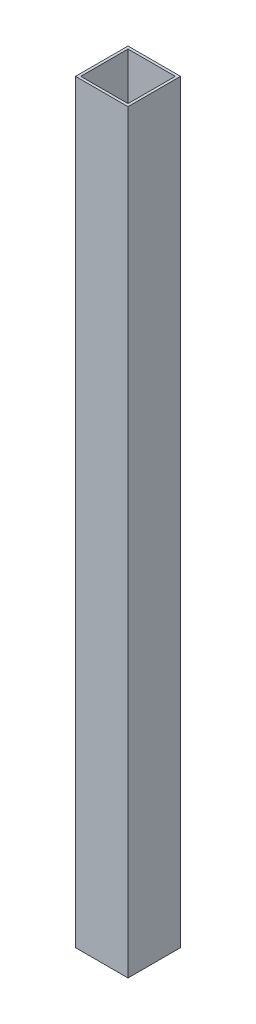
ISO-10303-21;
HEADER;
FILE_DESCRIPTION(('STEP AP214'),'2;1');
FILE_NAME('part.step','',(''),(''),'','','');
FILE_SCHEMA(('AUTOMOTIVE_DESIGN { 1 0 10303 214 1 1 1 1 }'));
ENDSEC;
DATA;
#1=APPLICATION_CONTEXT('core data for automotive mechanical design processes');
#2=APPLICATION_PROTOCOL_DEFINITION('international standard','automotive_design',2000,#1);
#3=PRODUCT_CONTEXT('',#1,'mechanical');
#4=PRODUCT('Part','Part','',(#3));
#5=PRODUCT_RELATED_PRODUCT_CATEGORY('part','',(#4));
#6=PRODUCT_DEFINITION_FORMATION('','',#4);
#7=PRODUCT_DEFINITION_CONTEXT('part definition',#1,'design');
#8=PRODUCT_DEFINITION('design','',#6,#7);
#9=PRODUCT_DEFINITION_SHAPE('','',#8);
#10=(LENGTH_UNIT() NAMED_UNIT(*) SI_UNIT(.MILLI.,.METRE.));
#11=(NAMED_UNIT(*) PLANE_ANGLE_UNIT() SI_UNIT($,.RADIAN.));
#12=(NAMED_UNIT(*) SI_UNIT($,.STERADIAN.) SOLID_ANGLE_UNIT());
#13=UNCERTAINTY_MEASURE_WITH_UNIT(LENGTH_MEASURE(1.E-05),#10,'distance_accuracy_value','');
#14=(GEOMETRIC_REPRESENTATION_CONTEXT(3) GLOBAL_UNCERTAINTY_ASSIGNED_CONTEXT((#13)) GLOBAL_UNIT_ASSIGNED_CONTEXT((#10,
#11,#12)) REPRESENTATION_CONTEXT('',''));
#15=CARTESIAN_POINT('',(0.,0.,0.));
#16=DIRECTION('',(0.,0.,1.));
#17=DIRECTION('',(1.,0.,0.));
#18=AXIS2_PLACEMENT_3D('',#15,#16,#17);
#19=CARTESIAN_POINT('',(0.,287.33,0.));
#20=DIRECTION('',(0.,-1.,0.));
#21=DIRECTION('',(0.,0.,-1.));
#22=AXIS2_PLACEMENT_3D('',#19,#20,#21);
#23=PLANE('',#22);
#24=DIRECTION('',(0.,0.,1.));
#25=VECTOR('',#24,1.);
#26=CARTESIAN_POINT('',(-10.,287.33,-10.));
#27=LINE('',#26,#25);
#28=CARTESIAN_POINT('',(-10.,287.33,-10.));
#29=VERTEX_POINT('',#28);
#30=CARTESIAN_POINT('',(-10.,287.33,10.));
#31=VERTEX_POINT('',#30);
#32=EDGE_CURVE('E155',#29,#31,#27,.T.);
#33=ORIENTED_EDGE('',*,*,#32,.T.);
#34=DIRECTION('',(1.,0.,0.));
#35=VECTOR('',#34,1.);
#36=CARTESIAN_POINT('',(10.,287.33,10.));
#37=LINE('',#36,#35);
#38=CARTESIAN_POINT('',(10.,287.33,10.));
#39=VERTEX_POINT('',#38);
#40=EDGE_CURVE('E159',#31,#39,#37,.T.);
#41=ORIENTED_EDGE('',*,*,#40,.T.);
#42=DIRECTION('',(0.,0.,-1.));
#43=VECTOR('',#42,1.);
#44=CARTESIAN_POINT('',(10.,287.33,-10.));
#45=LINE('',#44,#43);
#46=CARTESIAN_POINT('',(10.,287.33,-10.));
#47=VERTEX_POINT('',#46);
#48=EDGE_CURVE('E163',#39,#47,#45,.T.);
#49=ORIENTED_EDGE('',*,*,#48,.T.);
#50=DIRECTION('',(-1.,0.,0.));
#51=VECTOR('',#50,1.);
#52=CARTESIAN_POINT('',(10.,287.33,-10.));
#53=LINE('',#52,#51);
#54=EDGE_CURVE('E166',#47,#29,#53,.T.);
#55=ORIENTED_EDGE('',*,*,#54,.T.);
#56=EDGE_LOOP('',(#33,#41,#49,#55));
#57=FACE_BOUND('',#56,.T.);
#58=DIRECTION('',(0.,0.,1.));
#59=VECTOR('',#58,1.);
#60=CARTESIAN_POINT('',(-8.99999999999999,287.33,-9.));
#61=LINE('',#60,#59);
#62=CARTESIAN_POINT('',(-8.99999999999999,287.33,-9.));
#63=VERTEX_POINT('',#62);
#64=CARTESIAN_POINT('',(-8.99999999999999,287.33,9.));
#65=VERTEX_POINT('',#64);
#66=EDGE_CURVE('E107',#63,#65,#61,.T.);
#67=ORIENTED_EDGE('',*,*,#66,.F.);
#68=DIRECTION('',(-1.,0.,0.));
#69=VECTOR('',#68,1.);
#70=CARTESIAN_POINT('',(8.99999999999999,287.33,-9.));
#71=LINE('',#70,#69);
#72=CARTESIAN_POINT('',(8.99999999999999,287.33,-9.));
#73=VERTEX_POINT('',#72);
#74=EDGE_CURVE('E133',#73,#63,#71,.T.);
#75=ORIENTED_EDGE('',*,*,#74,.F.);
#76=DIRECTION('',(0.,0.,-1.));
#77=VECTOR('',#76,1.);
#78=CARTESIAN_POINT('',(8.99999999999999,287.33,-9.));
#79=LINE('',#78,#77);
#80=CARTESIAN_POINT('',(8.99999999999999,287.33,9.));
#81=VERTEX_POINT('',#80);
#82=EDGE_CURVE('E129',#81,#73,#79,.T.);
#83=ORIENTED_EDGE('',*,*,#82,.F.);
#84=DIRECTION('',(1.,0.,0.));
#85=VECTOR('',#84,1.);
#86=CARTESIAN_POINT('',(8.99999999999999,287.33,9.));
#87=LINE('',#86,#85);
#88=EDGE_CURVE('E116',#65,#81,#87,.T.);
#89=ORIENTED_EDGE('',*,*,#88,.F.);
#90=EDGE_LOOP('',(#67,#75,#83,#89));
#91=FACE_BOUND('',#90,.T.);
#92=ADVANCED_FACE('F41',(#57,#91),#23,.F.);
#93=CARTESIAN_POINT('',(0.,0.,0.));
#94=DIRECTION('',(0.,-1.,0.));
#95=DIRECTION('',(0.,0.,-1.));
#96=AXIS2_PLACEMENT_3D('',#93,#94,#95);
#97=PLANE('',#96);
#98=DIRECTION('',(0.,0.,1.));
#99=VECTOR('',#98,1.);
#100=CARTESIAN_POINT('',(-10.,0.,-10.));
#101=LINE('',#100,#99);
#102=CARTESIAN_POINT('',(-10.,0.,-10.));
#103=VERTEX_POINT('',#102);
#104=CARTESIAN_POINT('',(-10.,0.,10.));
#105=VERTEX_POINT('',#104);
#106=EDGE_CURVE('E125',#103,#105,#101,.T.);
#107=ORIENTED_EDGE('',*,*,#106,.F.);
#108=DIRECTION('',(-1.,0.,0.));
#109=VECTOR('',#108,1.);
#110=CARTESIAN_POINT('',(10.,0.,-10.));
#111=LINE('',#110,#109);
#112=CARTESIAN_POINT('',(10.,0.,-10.));
#113=VERTEX_POINT('',#112);
#114=EDGE_CURVE('E160',#113,#103,#111,.T.);
#115=ORIENTED_EDGE('',*,*,#114,.F.);
#116=DIRECTION('',(0.,0.,-1.));
#117=VECTOR('',#116,1.);
#118=CARTESIAN_POINT('',(10.,0.,-10.));
#119=LINE('',#118,#117);
#120=CARTESIAN_POINT('',(10.,0.,10.));
#121=VERTEX_POINT('',#120);
#122=EDGE_CURVE('E176',#121,#113,#119,.T.);
#123=ORIENTED_EDGE('',*,*,#122,.F.);
#124=DIRECTION('',(1.,0.,0.));
#125=VECTOR('',#124,1.);
#126=CARTESIAN_POINT('',(10.,0.,10.));
#127=LINE('',#126,#125);
#128=EDGE_CURVE('E173',#105,#121,#127,.T.);
#129=ORIENTED_EDGE('',*,*,#128,.F.);
#130=EDGE_LOOP('',(#107,#115,#123,#129));
#131=FACE_BOUND('',#130,.T.);
#132=DIRECTION('',(-1.,0.,0.));
#133=VECTOR('',#132,1.);
#134=CARTESIAN_POINT('',(8.99999999999999,0.,-9.));
#135=LINE('',#134,#133);
#136=CARTESIAN_POINT('',(8.99999999999999,0.,-9.));
#137=VERTEX_POINT('',#136);
#138=CARTESIAN_POINT('',(-8.99999999999999,0.,-9.));
#139=VERTEX_POINT('',#138);
#140=EDGE_CURVE('E117',#137,#139,#135,.T.);
#141=ORIENTED_EDGE('',*,*,#140,.T.);
#142=DIRECTION('',(0.,0.,1.));
#143=VECTOR('',#142,1.);
#144=CARTESIAN_POINT('',(-8.99999999999999,0.,-9.));
#145=LINE('',#144,#143);
#146=CARTESIAN_POINT('',(-8.99999999999999,0.,9.));
#147=VERTEX_POINT('',#146);
#148=EDGE_CURVE('E65',#139,#147,#145,.T.);
#149=ORIENTED_EDGE('',*,*,#148,.T.);
#150=DIRECTION('',(1.,0.,0.));
#151=VECTOR('',#150,1.);
#152=CARTESIAN_POINT('',(8.99999999999999,0.,9.));
#153=LINE('',#152,#151);
#154=CARTESIAN_POINT('',(8.99999999999999,0.,9.));
#155=VERTEX_POINT('',#154);
#156=EDGE_CURVE('E123',#147,#155,#153,.T.);
#157=ORIENTED_EDGE('',*,*,#156,.T.);
#158=DIRECTION('',(0.,0.,-1.));
#159=VECTOR('',#158,1.);
#160=CARTESIAN_POINT('',(8.99999999999999,0.,-9.));
#161=LINE('',#160,#159);
#162=EDGE_CURVE('E142',#155,#137,#161,.T.);
#163=ORIENTED_EDGE('',*,*,#162,.T.);
#164=EDGE_LOOP('',(#141,#149,#157,#163));
#165=FACE_BOUND('',#164,.T.);
#166=ADVANCED_FACE('F199',(#131,#165),#97,.T.);
#167=CARTESIAN_POINT('',(-10.,287.33,-10.));
#168=DIRECTION('',(1.,0.,0.));
#169=DIRECTION('',(0.,0.,-1.));
#170=AXIS2_PLACEMENT_3D('',#167,#168,#169);
#171=PLANE('',#170);
#172=ORIENTED_EDGE('',*,*,#106,.T.);
#173=DIRECTION('',(0.,-1.,0.));
#174=VECTOR('',#173,1.);
#175=CARTESIAN_POINT('',(-10.,287.33,10.));
#176=LINE('',#175,#174);
#177=EDGE_CURVE('E11',#31,#105,#176,.T.);
#178=ORIENTED_EDGE('',*,*,#177,.F.);
#179=ORIENTED_EDGE('',*,*,#32,.F.);
#180=DIRECTION('',(0.,-1.,0.));
#181=VECTOR('',#180,1.);
#182=CARTESIAN_POINT('',(-10.,287.33,-10.));
#183=LINE('',#182,#181);
#184=EDGE_CURVE('E169',#29,#103,#183,.T.);
#185=ORIENTED_EDGE('',*,*,#184,.T.);
#186=EDGE_LOOP('',(#172,#178,#179,#185));
#187=FACE_BOUND('',#186,.T.);
#188=ADVANCED_FACE('F43',(#187),#171,.F.);
#189=CARTESIAN_POINT('',(10.,287.33,10.));
#190=DIRECTION('',(0.,0.,-1.));
#191=DIRECTION('',(-1.,0.,0.));
#192=AXIS2_PLACEMENT_3D('',#189,#190,#191);
#193=PLANE('',#192);
#194=ORIENTED_EDGE('',*,*,#128,.T.);
#195=DIRECTION('',(0.,-1.,0.));
#196=VECTOR('',#195,1.);
#197=CARTESIAN_POINT('',(10.,287.33,10.));
#198=LINE('',#197,#196);
#199=EDGE_CURVE('E50',#39,#121,#198,.T.);
#200=ORIENTED_EDGE('',*,*,#199,.F.);
#201=ORIENTED_EDGE('',*,*,#40,.F.);
#202=ORIENTED_EDGE('',*,*,#177,.T.);
#203=EDGE_LOOP('',(#194,#200,#201,#202));
#204=FACE_BOUND('',#203,.T.);
#205=ADVANCED_FACE('F209',(#204),#193,.F.);
#206=CARTESIAN_POINT('',(10.,287.33,-10.));
#207=DIRECTION('',(-1.,0.,0.));
#208=DIRECTION('',(0.,0.,1.));
#209=AXIS2_PLACEMENT_3D('',#206,#207,#208);
#210=PLANE('',#209);
#211=ORIENTED_EDGE('',*,*,#122,.T.);
#212=DIRECTION('',(0.,-1.,0.));
#213=VECTOR('',#212,1.);
#214=CARTESIAN_POINT('',(10.,287.33,-10.));
#215=LINE('',#214,#213);
#216=EDGE_CURVE('E184',#47,#113,#215,.T.);
#217=ORIENTED_EDGE('',*,*,#216,.F.);
#218=ORIENTED_EDGE('',*,*,#48,.F.);
#219=ORIENTED_EDGE('',*,*,#199,.T.);
#220=EDGE_LOOP('',(#211,#217,#218,#219));
#221=FACE_BOUND('',#220,.T.);
#222=ADVANCED_FACE('F193',(#221),#210,.F.);
#223=CARTESIAN_POINT('',(10.,287.33,-10.));
#224=DIRECTION('',(0.,0.,1.));
#225=DIRECTION('',(1.,0.,0.));
#226=AXIS2_PLACEMENT_3D('',#223,#224,#225);
#227=PLANE('',#226);
#228=ORIENTED_EDGE('',*,*,#114,.T.);
#229=ORIENTED_EDGE('',*,*,#184,.F.);
#230=ORIENTED_EDGE('',*,*,#54,.F.);
#231=ORIENTED_EDGE('',*,*,#216,.T.);
#232=EDGE_LOOP('',(#228,#229,#230,#231));
#233=FACE_BOUND('',#232,.T.);
#234=ADVANCED_FACE('F203',(#233),#227,.F.);
#235=CARTESIAN_POINT('',(-8.99999999999999,287.33,-9.));
#236=DIRECTION('',(1.,0.,0.));
#237=DIRECTION('',(0.,0.,-1.));
#238=AXIS2_PLACEMENT_3D('',#235,#236,#237);
#239=PLANE('',#238);
#240=ORIENTED_EDGE('',*,*,#148,.F.);
#241=DIRECTION('',(0.,-1.,0.));
#242=VECTOR('',#241,1.);
#243=CARTESIAN_POINT('',(-8.99999999999999,287.33,-9.));
#244=LINE('',#243,#242);
#245=EDGE_CURVE('E111',#63,#139,#244,.T.);
#246=ORIENTED_EDGE('',*,*,#245,.F.);
#247=ORIENTED_EDGE('',*,*,#66,.T.);
#248=DIRECTION('',(0.,-1.,0.));
#249=VECTOR('',#248,1.);
#250=CARTESIAN_POINT('',(-8.99999999999999,287.33,9.));
#251=LINE('',#250,#249);
#252=EDGE_CURVE('E110',#65,#147,#251,.T.);
#253=ORIENTED_EDGE('',*,*,#252,.T.);
#254=EDGE_LOOP('',(#240,#246,#247,#253));
#255=FACE_BOUND('',#254,.T.);
#256=ADVANCED_FACE('F109',(#255),#239,.T.);
#257=CARTESIAN_POINT('',(8.99999999999999,287.33,9.));
#258=DIRECTION('',(0.,0.,-1.));
#259=DIRECTION('',(-1.,0.,0.));
#260=AXIS2_PLACEMENT_3D('',#257,#258,#259);
#261=PLANE('',#260);
#262=ORIENTED_EDGE('',*,*,#156,.F.);
#263=ORIENTED_EDGE('',*,*,#252,.F.);
#264=ORIENTED_EDGE('',*,*,#88,.T.);
#265=DIRECTION('',(0.,-1.,0.));
#266=VECTOR('',#265,1.);
#267=CARTESIAN_POINT('',(8.99999999999999,287.33,9.));
#268=LINE('',#267,#266);
#269=EDGE_CURVE('E126',#81,#155,#268,.T.);
#270=ORIENTED_EDGE('',*,*,#269,.T.);
#271=EDGE_LOOP('',(#262,#263,#264,#270));
#272=FACE_BOUND('',#271,.T.);
#273=ADVANCED_FACE('F120',(#272),#261,.T.);
#274=CARTESIAN_POINT('',(8.99999999999999,287.33,-9.));
#275=DIRECTION('',(-1.,0.,0.));
#276=DIRECTION('',(0.,0.,1.));
#277=AXIS2_PLACEMENT_3D('',#274,#275,#276);
#278=PLANE('',#277);
#279=ORIENTED_EDGE('',*,*,#162,.F.);
#280=ORIENTED_EDGE('',*,*,#269,.F.);
#281=ORIENTED_EDGE('',*,*,#82,.T.);
#282=DIRECTION('',(0.,-1.,0.));
#283=VECTOR('',#282,1.);
#284=CARTESIAN_POINT('',(8.99999999999999,287.33,-9.));
#285=LINE('',#284,#283);
#286=EDGE_CURVE('E57',#73,#137,#285,.T.);
#287=ORIENTED_EDGE('',*,*,#286,.T.);
#288=EDGE_LOOP('',(#279,#280,#281,#287));
#289=FACE_BOUND('',#288,.T.);
#290=ADVANCED_FACE('F232',(#289),#278,.T.);
#291=CARTESIAN_POINT('',(8.99999999999999,287.33,-9.));
#292=DIRECTION('',(0.,0.,1.));
#293=DIRECTION('',(1.,0.,0.));
#294=AXIS2_PLACEMENT_3D('',#291,#292,#293);
#295=PLANE('',#294);
#296=ORIENTED_EDGE('',*,*,#140,.F.);
#297=ORIENTED_EDGE('',*,*,#286,.F.);
#298=ORIENTED_EDGE('',*,*,#74,.T.);
#299=ORIENTED_EDGE('',*,*,#245,.T.);
#300=EDGE_LOOP('',(#296,#297,#298,#299));
#301=FACE_BOUND('',#300,.T.);
#302=ADVANCED_FACE('F236',(#301),#295,.T.);
#303=CLOSED_SHELL('',(#92,#166,#188,#205,#222,#234,#256,#273,#290,#302));
#304=MANIFOLD_SOLID_BREP('B2',#303);
#305=ADVANCED_BREP_SHAPE_REPRESENTATION('',(#18,#304),#14);
#306=SHAPE_DEFINITION_REPRESENTATION(#9,#305);
ENDSEC;
END-ISO-10303-21;
